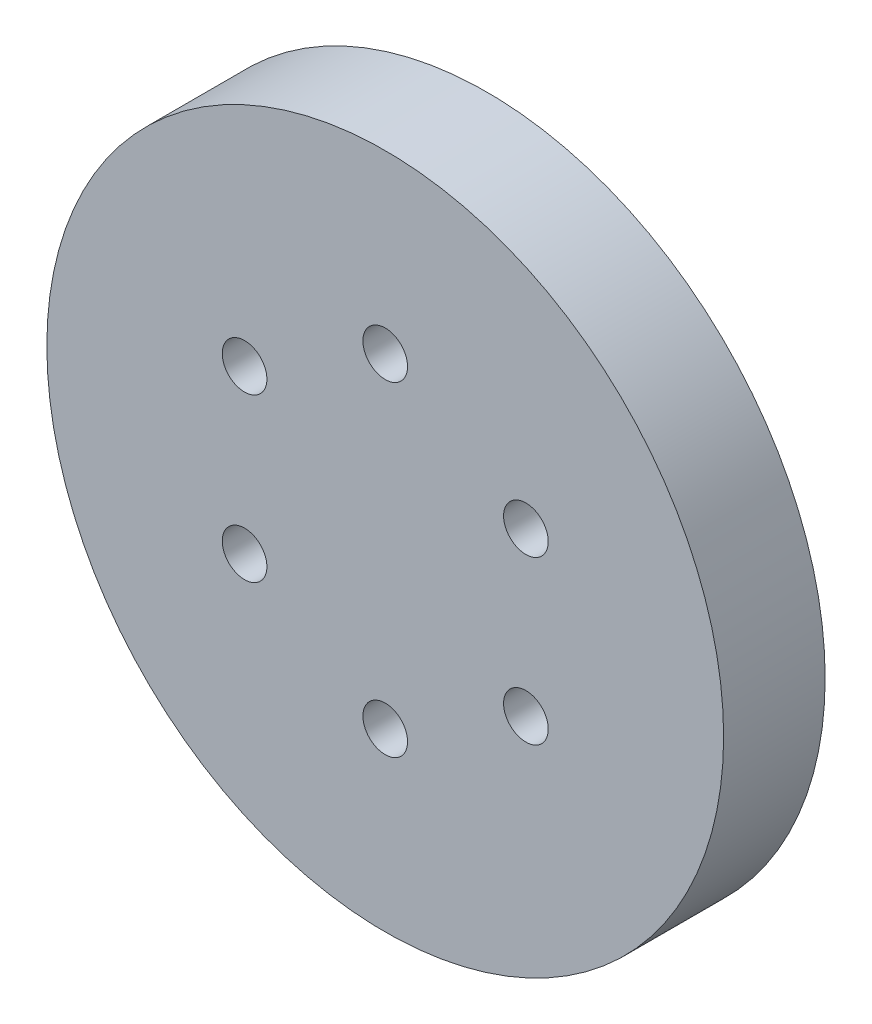
ISO-10303-21;
HEADER;
FILE_DESCRIPTION(('STEP AP214'),'2;1');
FILE_NAME('part.step','',(''),(''),'','','');
FILE_SCHEMA(('AUTOMOTIVE_DESIGN { 1 0 10303 214 1 1 1 1 }'));
ENDSEC;
DATA;
#1=APPLICATION_CONTEXT('core data for automotive mechanical design processes');
#2=APPLICATION_PROTOCOL_DEFINITION('international standard','automotive_design',2000,#1);
#3=PRODUCT_CONTEXT('',#1,'mechanical');
#4=PRODUCT('Part','Part','',(#3));
#5=PRODUCT_RELATED_PRODUCT_CATEGORY('part','',(#4));
#6=PRODUCT_DEFINITION_FORMATION('','',#4);
#7=PRODUCT_DEFINITION_CONTEXT('part definition',#1,'design');
#8=PRODUCT_DEFINITION('design','',#6,#7);
#9=PRODUCT_DEFINITION_SHAPE('','',#8);
#10=(LENGTH_UNIT() NAMED_UNIT(*) SI_UNIT(.MILLI.,.METRE.));
#11=(NAMED_UNIT(*) PLANE_ANGLE_UNIT() SI_UNIT($,.RADIAN.));
#12=(NAMED_UNIT(*) SI_UNIT($,.STERADIAN.) SOLID_ANGLE_UNIT());
#13=UNCERTAINTY_MEASURE_WITH_UNIT(LENGTH_MEASURE(1.E-05),#10,'distance_accuracy_value','');
#14=(GEOMETRIC_REPRESENTATION_CONTEXT(3) GLOBAL_UNCERTAINTY_ASSIGNED_CONTEXT((#13)) GLOBAL_UNIT_ASSIGNED_CONTEXT((#10,
#11,#12)) REPRESENTATION_CONTEXT('',''));
#15=CARTESIAN_POINT('',(0.,0.,0.));
#16=DIRECTION('',(0.,0.,1.));
#17=DIRECTION('',(1.,0.,0.));
#18=AXIS2_PLACEMENT_3D('',#15,#16,#17);
#19=CARTESIAN_POINT('',(0.,0.,7.5));
#20=DIRECTION('',(0.,0.,1.));
#21=DIRECTION('',(1.,0.,0.));
#22=AXIS2_PLACEMENT_3D('',#19,#20,#21);
#23=PLANE('',#22);
#24=CARTESIAN_POINT('',(-10.3923048454133,-6.00000000000001,7.5));
#25=DIRECTION('',(0.,0.,1.));
#26=DIRECTION('',(1.,0.,0.));
#27=AXIS2_PLACEMENT_3D('',#24,#25,#26);
#28=CIRCLE('',#27,1.65);
#29=CARTESIAN_POINT('',(-8.74230484541326,-6.00000000000001,7.5));
#30=VERTEX_POINT('',#29);
#31=EDGE_CURVE('E89',#30,#30,#28,.T.);
#32=ORIENTED_EDGE('',*,*,#31,.F.);
#33=EDGE_LOOP('',(#32));
#34=FACE_BOUND('',#33,.T.);
#35=CARTESIAN_POINT('',(10.3923048454133,-6.,7.5));
#36=DIRECTION('',(0.,0.,1.));
#37=DIRECTION('',(1.,0.,0.));
#38=AXIS2_PLACEMENT_3D('',#35,#36,#37);
#39=CIRCLE('',#38,1.65);
#40=CARTESIAN_POINT('',(12.0423048454133,-6.,7.5));
#41=VERTEX_POINT('',#40);
#42=EDGE_CURVE('E74',#41,#41,#39,.T.);
#43=ORIENTED_EDGE('',*,*,#42,.F.);
#44=EDGE_LOOP('',(#43));
#45=FACE_BOUND('',#44,.T.);
#46=CARTESIAN_POINT('',(0.,12.,7.5));
#47=DIRECTION('',(0.,0.,1.));
#48=DIRECTION('',(1.,0.,0.));
#49=AXIS2_PLACEMENT_3D('',#46,#47,#48);
#50=CIRCLE('',#49,1.65);
#51=CARTESIAN_POINT('',(1.65,12.,7.5));
#52=VERTEX_POINT('',#51);
#53=EDGE_CURVE('E61',#52,#52,#50,.T.);
#54=ORIENTED_EDGE('',*,*,#53,.F.);
#55=EDGE_LOOP('',(#54));
#56=FACE_BOUND('',#55,.T.);
#57=CARTESIAN_POINT('',(0.,0.,7.5));
#58=DIRECTION('',(0.,0.,1.));
#59=DIRECTION('',(1.,0.,0.));
#60=AXIS2_PLACEMENT_3D('',#57,#58,#59);
#61=CIRCLE('',#60,25.);
#62=CARTESIAN_POINT('',(25.,0.,7.5));
#63=VERTEX_POINT('',#62);
#64=EDGE_CURVE('E10',#63,#63,#61,.T.);
#65=ORIENTED_EDGE('',*,*,#64,.T.);
#66=EDGE_LOOP('',(#65));
#67=FACE_BOUND('',#66,.T.);
#68=CARTESIAN_POINT('',(10.3923048454133,6.,7.5));
#69=DIRECTION('',(0.,0.,1.));
#70=DIRECTION('',(1.,0.,0.));
#71=AXIS2_PLACEMENT_3D('',#68,#69,#70);
#72=CIRCLE('',#71,1.65);
#73=CARTESIAN_POINT('',(12.0423048454133,6.,7.5));
#74=VERTEX_POINT('',#73);
#75=EDGE_CURVE('E69',#74,#74,#72,.T.);
#76=ORIENTED_EDGE('',*,*,#75,.F.);
#77=EDGE_LOOP('',(#76));
#78=FACE_BOUND('',#77,.T.);
#79=CARTESIAN_POINT('',(0.,-12.,7.5));
#80=DIRECTION('',(0.,0.,1.));
#81=DIRECTION('',(1.,0.,0.));
#82=AXIS2_PLACEMENT_3D('',#79,#80,#81);
#83=CIRCLE('',#82,1.65);
#84=CARTESIAN_POINT('',(1.65,-12.,7.5));
#85=VERTEX_POINT('',#84);
#86=EDGE_CURVE('E84',#85,#85,#83,.T.);
#87=ORIENTED_EDGE('',*,*,#86,.F.);
#88=EDGE_LOOP('',(#87));
#89=FACE_BOUND('',#88,.T.);
#90=CARTESIAN_POINT('',(-10.3923048454133,5.99999999999999,7.5));
#91=DIRECTION('',(0.,0.,1.));
#92=DIRECTION('',(1.,0.,0.));
#93=AXIS2_PLACEMENT_3D('',#90,#91,#92);
#94=CIRCLE('',#93,1.65);
#95=CARTESIAN_POINT('',(-8.74230484541327,5.99999999999999,7.5));
#96=VERTEX_POINT('',#95);
#97=EDGE_CURVE('E98',#96,#96,#94,.T.);
#98=ORIENTED_EDGE('',*,*,#97,.F.);
#99=EDGE_LOOP('',(#98));
#100=FACE_BOUND('',#99,.T.);
#101=ADVANCED_FACE('F50',(#34,#45,#56,#67,#78,#89,#100),#23,.T.);
#102=CARTESIAN_POINT('',(0.,0.,0.));
#103=DIRECTION('',(0.,0.,1.));
#104=DIRECTION('',(1.,0.,0.));
#105=AXIS2_PLACEMENT_3D('',#102,#103,#104);
#106=PLANE('',#105);
#107=CARTESIAN_POINT('',(0.,0.,0.));
#108=DIRECTION('',(0.,0.,1.));
#109=DIRECTION('',(1.,0.,0.));
#110=AXIS2_PLACEMENT_3D('',#107,#108,#109);
#111=CIRCLE('',#110,25.);
#112=CARTESIAN_POINT('',(25.,0.,0.));
#113=VERTEX_POINT('',#112);
#114=EDGE_CURVE('E51',#113,#113,#111,.T.);
#115=ORIENTED_EDGE('',*,*,#114,.F.);
#116=EDGE_LOOP('',(#115));
#117=FACE_BOUND('',#116,.T.);
#118=CARTESIAN_POINT('',(0.,12.,0.));
#119=DIRECTION('',(0.,0.,1.));
#120=DIRECTION('',(1.,0.,0.));
#121=AXIS2_PLACEMENT_3D('',#118,#119,#120);
#122=CIRCLE('',#121,1.65);
#123=CARTESIAN_POINT('',(1.65,12.,0.));
#124=VERTEX_POINT('',#123);
#125=EDGE_CURVE('E62',#124,#124,#122,.T.);
#126=ORIENTED_EDGE('',*,*,#125,.T.);
#127=EDGE_LOOP('',(#126));
#128=FACE_BOUND('',#127,.T.);
#129=CARTESIAN_POINT('',(10.3923048454133,6.,0.));
#130=DIRECTION('',(0.,0.,1.));
#131=DIRECTION('',(1.,0.,0.));
#132=AXIS2_PLACEMENT_3D('',#129,#130,#131);
#133=CIRCLE('',#132,1.65);
#134=CARTESIAN_POINT('',(12.0423048454133,6.,0.));
#135=VERTEX_POINT('',#134);
#136=EDGE_CURVE('E66',#135,#135,#133,.T.);
#137=ORIENTED_EDGE('',*,*,#136,.T.);
#138=EDGE_LOOP('',(#137));
#139=FACE_BOUND('',#138,.T.);
#140=CARTESIAN_POINT('',(10.3923048454133,-6.,0.));
#141=DIRECTION('',(0.,0.,1.));
#142=DIRECTION('',(1.,0.,0.));
#143=AXIS2_PLACEMENT_3D('',#140,#141,#142);
#144=CIRCLE('',#143,1.65);
#145=CARTESIAN_POINT('',(12.0423048454133,-6.,0.));
#146=VERTEX_POINT('',#145);
#147=EDGE_CURVE('E77',#146,#146,#144,.T.);
#148=ORIENTED_EDGE('',*,*,#147,.T.);
#149=EDGE_LOOP('',(#148));
#150=FACE_BOUND('',#149,.T.);
#151=CARTESIAN_POINT('',(0.,-12.,0.));
#152=DIRECTION('',(0.,0.,1.));
#153=DIRECTION('',(1.,0.,0.));
#154=AXIS2_PLACEMENT_3D('',#151,#152,#153);
#155=CIRCLE('',#154,1.65);
#156=CARTESIAN_POINT('',(1.65,-12.,0.));
#157=VERTEX_POINT('',#156);
#158=EDGE_CURVE('E88',#157,#157,#155,.T.);
#159=ORIENTED_EDGE('',*,*,#158,.T.);
#160=EDGE_LOOP('',(#159));
#161=FACE_BOUND('',#160,.T.);
#162=CARTESIAN_POINT('',(-10.3923048454133,-6.00000000000001,0.));
#163=DIRECTION('',(0.,0.,1.));
#164=DIRECTION('',(1.,0.,0.));
#165=AXIS2_PLACEMENT_3D('',#162,#163,#164);
#166=CIRCLE('',#165,1.65);
#167=CARTESIAN_POINT('',(-8.74230484541326,-6.00000000000001,0.));
#168=VERTEX_POINT('',#167);
#169=EDGE_CURVE('E94',#168,#168,#166,.T.);
#170=ORIENTED_EDGE('',*,*,#169,.T.);
#171=EDGE_LOOP('',(#170));
#172=FACE_BOUND('',#171,.T.);
#173=CARTESIAN_POINT('',(-10.3923048454133,5.99999999999999,0.));
#174=DIRECTION('',(0.,0.,1.));
#175=DIRECTION('',(1.,0.,0.));
#176=AXIS2_PLACEMENT_3D('',#173,#174,#175);
#177=CIRCLE('',#176,1.65);
#178=CARTESIAN_POINT('',(-8.74230484541327,5.99999999999999,0.));
#179=VERTEX_POINT('',#178);
#180=EDGE_CURVE('E105',#179,#179,#177,.T.);
#181=ORIENTED_EDGE('',*,*,#180,.T.);
#182=EDGE_LOOP('',(#181));
#183=FACE_BOUND('',#182,.T.);
#184=ADVANCED_FACE('F111',(#117,#128,#139,#150,#161,#172,#183),#106,.F.);
#185=CARTESIAN_POINT('',(0.,0.,7.5));
#186=DIRECTION('',(0.,0.,-1.));
#187=DIRECTION('',(-1.,0.,0.));
#188=AXIS2_PLACEMENT_3D('',#185,#186,#187);
#189=CYLINDRICAL_SURFACE('',#188,25.);
#190=ORIENTED_EDGE('',*,*,#64,.F.);
#191=EDGE_LOOP('',(#190));
#192=FACE_BOUND('',#191,.T.);
#193=ORIENTED_EDGE('',*,*,#114,.T.);
#194=EDGE_LOOP('',(#193));
#195=FACE_BOUND('',#194,.T.);
#196=ADVANCED_FACE('F47',(#192,#195),#189,.T.);
#197=CARTESIAN_POINT('',(0.,12.,7.5));
#198=DIRECTION('',(0.,0.,-1.));
#199=DIRECTION('',(-1.,0.,0.));
#200=AXIS2_PLACEMENT_3D('',#197,#198,#199);
#201=CYLINDRICAL_SURFACE('',#200,1.65);
#202=ORIENTED_EDGE('',*,*,#53,.T.);
#203=EDGE_LOOP('',(#202));
#204=FACE_BOUND('',#203,.T.);
#205=ORIENTED_EDGE('',*,*,#125,.F.);
#206=EDGE_LOOP('',(#205));
#207=FACE_BOUND('',#206,.T.);
#208=ADVANCED_FACE('F122',(#204,#207),#201,.F.);
#209=CARTESIAN_POINT('',(10.3923048454133,6.,7.5));
#210=DIRECTION('',(0.,0.,-1.));
#211=DIRECTION('',(-1.,0.,0.));
#212=AXIS2_PLACEMENT_3D('',#209,#210,#211);
#213=CYLINDRICAL_SURFACE('',#212,1.65);
#214=ORIENTED_EDGE('',*,*,#75,.T.);
#215=EDGE_LOOP('',(#214));
#216=FACE_BOUND('',#215,.T.);
#217=ORIENTED_EDGE('',*,*,#136,.F.);
#218=EDGE_LOOP('',(#217));
#219=FACE_BOUND('',#218,.T.);
#220=ADVANCED_FACE('F127',(#216,#219),#213,.F.);
#221=CARTESIAN_POINT('',(10.3923048454133,-6.,7.5));
#222=DIRECTION('',(0.,0.,-1.));
#223=DIRECTION('',(-1.,0.,0.));
#224=AXIS2_PLACEMENT_3D('',#221,#222,#223);
#225=CYLINDRICAL_SURFACE('',#224,1.65);
#226=ORIENTED_EDGE('',*,*,#42,.T.);
#227=EDGE_LOOP('',(#226));
#228=FACE_BOUND('',#227,.T.);
#229=ORIENTED_EDGE('',*,*,#147,.F.);
#230=EDGE_LOOP('',(#229));
#231=FACE_BOUND('',#230,.T.);
#232=ADVANCED_FACE('F128',(#228,#231),#225,.F.);
#233=CARTESIAN_POINT('',(0.,-12.,7.5));
#234=DIRECTION('',(0.,0.,-1.));
#235=DIRECTION('',(-1.,0.,0.));
#236=AXIS2_PLACEMENT_3D('',#233,#234,#235);
#237=CYLINDRICAL_SURFACE('',#236,1.65);
#238=ORIENTED_EDGE('',*,*,#86,.T.);
#239=EDGE_LOOP('',(#238));
#240=FACE_BOUND('',#239,.T.);
#241=ORIENTED_EDGE('',*,*,#158,.F.);
#242=EDGE_LOOP('',(#241));
#243=FACE_BOUND('',#242,.T.);
#244=ADVANCED_FACE('F133',(#240,#243),#237,.F.);
#245=CARTESIAN_POINT('',(-10.3923048454133,-6.00000000000001,7.5));
#246=DIRECTION('',(0.,0.,-1.));
#247=DIRECTION('',(-1.,0.,0.));
#248=AXIS2_PLACEMENT_3D('',#245,#246,#247);
#249=CYLINDRICAL_SURFACE('',#248,1.65);
#250=ORIENTED_EDGE('',*,*,#31,.T.);
#251=EDGE_LOOP('',(#250));
#252=FACE_BOUND('',#251,.T.);
#253=ORIENTED_EDGE('',*,*,#169,.F.);
#254=EDGE_LOOP('',(#253));
#255=FACE_BOUND('',#254,.T.);
#256=ADVANCED_FACE('F137',(#252,#255),#249,.F.);
#257=CARTESIAN_POINT('',(-10.3923048454133,5.99999999999999,7.5));
#258=DIRECTION('',(0.,0.,-1.));
#259=DIRECTION('',(-1.,0.,0.));
#260=AXIS2_PLACEMENT_3D('',#257,#258,#259);
#261=CYLINDRICAL_SURFACE('',#260,1.65);
#262=ORIENTED_EDGE('',*,*,#97,.T.);
#263=EDGE_LOOP('',(#262));
#264=FACE_BOUND('',#263,.T.);
#265=ORIENTED_EDGE('',*,*,#180,.F.);
#266=EDGE_LOOP('',(#265));
#267=FACE_BOUND('',#266,.T.);
#268=ADVANCED_FACE('F109',(#264,#267),#261,.F.);
#269=CLOSED_SHELL('',(#101,#184,#196,#208,#220,#232,#244,#256,#268));
#270=MANIFOLD_SOLID_BREP('B2',#269);
#271=ADVANCED_BREP_SHAPE_REPRESENTATION('',(#18,#270),#14);
#272=SHAPE_DEFINITION_REPRESENTATION(#9,#271);
ENDSEC;
END-ISO-10303-21;
